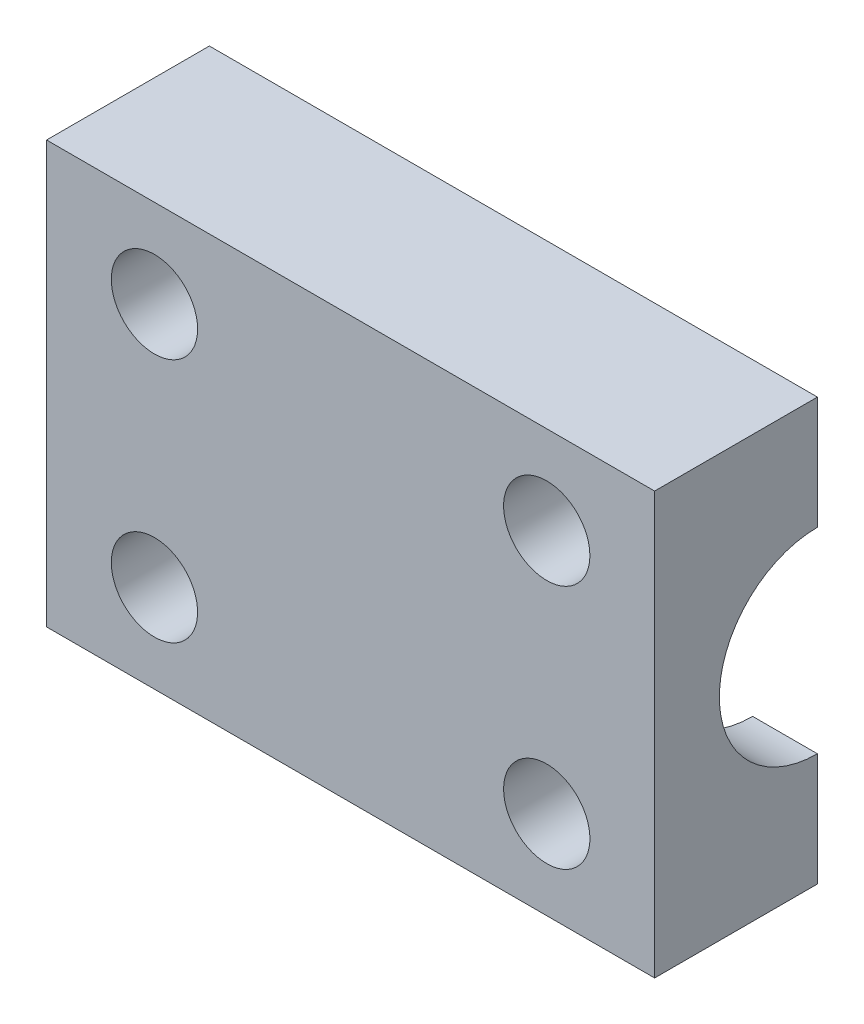
ISO-10303-21;
HEADER;
FILE_DESCRIPTION(('STEP AP214'),'2;1');
FILE_NAME('part.step','',(''),(''),'','','');
FILE_SCHEMA(('AUTOMOTIVE_DESIGN { 1 0 10303 214 1 1 1 1 }'));
ENDSEC;
DATA;
#1=APPLICATION_CONTEXT('core data for automotive mechanical design processes');
#2=APPLICATION_PROTOCOL_DEFINITION('international standard','automotive_design',2000,#1);
#3=PRODUCT_CONTEXT('',#1,'mechanical');
#4=PRODUCT('Part','Part','',(#3));
#5=PRODUCT_RELATED_PRODUCT_CATEGORY('part','',(#4));
#6=PRODUCT_DEFINITION_FORMATION('','',#4);
#7=PRODUCT_DEFINITION_CONTEXT('part definition',#1,'design');
#8=PRODUCT_DEFINITION('design','',#6,#7);
#9=PRODUCT_DEFINITION_SHAPE('','',#8);
#10=(LENGTH_UNIT() NAMED_UNIT(*) SI_UNIT(.MILLI.,.METRE.));
#11=(NAMED_UNIT(*) PLANE_ANGLE_UNIT() SI_UNIT($,.RADIAN.));
#12=(NAMED_UNIT(*) SI_UNIT($,.STERADIAN.) SOLID_ANGLE_UNIT());
#13=UNCERTAINTY_MEASURE_WITH_UNIT(LENGTH_MEASURE(1.E-05),#10,'distance_accuracy_value','');
#14=(GEOMETRIC_REPRESENTATION_CONTEXT(3) GLOBAL_UNCERTAINTY_ASSIGNED_CONTEXT((#13)) GLOBAL_UNIT_ASSIGNED_CONTEXT((#10,
#11,#12)) REPRESENTATION_CONTEXT('',''));
#15=CARTESIAN_POINT('',(0.,0.,0.));
#16=DIRECTION('',(0.,0.,1.));
#17=DIRECTION('',(1.,0.,0.));
#18=AXIS2_PLACEMENT_3D('',#15,#16,#17);
#19=CARTESIAN_POINT('',(18.,10.75,-8.3));
#20=DIRECTION('',(0.,0.,-1.));
#21=DIRECTION('',(-1.,0.,0.));
#22=AXIS2_PLACEMENT_3D('',#19,#20,#21);
#23=PLANE('',#22);
#24=DIRECTION('',(-1.,0.,0.));
#25=VECTOR('',#24,1.);
#26=CARTESIAN_POINT('',(-13.,-5.00000000000001,-8.3));
#27=LINE('',#26,#25);
#28=CARTESIAN_POINT('',(-0.699999999999998,-5.00000000000001,-8.3));
#29=VERTEX_POINT('',#28);
#30=CARTESIAN_POINT('',(-5.3,-5.00000000000001,-8.3));
#31=VERTEX_POINT('',#30);
#32=EDGE_CURVE('E373',#29,#31,#27,.T.);
#33=ORIENTED_EDGE('',*,*,#32,.F.);
#34=DIRECTION('',(0.,1.,0.));
#35=VECTOR('',#34,1.);
#36=CARTESIAN_POINT('',(-0.699999999999998,-7.52320508075776,-8.29999999999999));
#37=LINE('',#36,#35);
#38=CARTESIAN_POINT('',(-0.699999999999998,-7.52320508075776,-8.29999999999999));
#39=VERTEX_POINT('',#38);
#40=EDGE_CURVE('E311',#39,#29,#37,.T.);
#41=ORIENTED_EDGE('',*,*,#40,.F.);
#42=DIRECTION('',(1.,0.,0.));
#43=VECTOR('',#42,1.);
#44=CARTESIAN_POINT('',(-0.699999999999998,-7.52320508075776,-8.29999999999999));
#45=LINE('',#44,#43);
#46=CARTESIAN_POINT('',(5.7,-7.52320508075776,-8.29999999999999));
#47=VERTEX_POINT('',#46);
#48=EDGE_CURVE('E320',#39,#47,#45,.T.);
#49=ORIENTED_EDGE('',*,*,#48,.T.);
#50=DIRECTION('',(0.,1.,0.));
#51=VECTOR('',#50,1.);
#52=CARTESIAN_POINT('',(5.7,-7.52320508075776,-8.29999999999999));
#53=LINE('',#52,#51);
#54=CARTESIAN_POINT('',(5.7,-5.00000000000001,-8.29999999999999));
#55=VERTEX_POINT('',#54);
#56=EDGE_CURVE('E324',#47,#55,#53,.T.);
#57=ORIENTED_EDGE('',*,*,#56,.T.);
#58=DIRECTION('',(-1.,0.,0.));
#59=VECTOR('',#58,1.);
#60=CARTESIAN_POINT('',(5.7,-5.00000000000001,-8.3));
#61=LINE('',#60,#59);
#62=CARTESIAN_POINT('',(10.3,-5.00000000000001,-8.3));
#63=VERTEX_POINT('',#62);
#64=EDGE_CURVE('E440',#63,#55,#61,.T.);
#65=ORIENTED_EDGE('',*,*,#64,.F.);
#66=DIRECTION('',(0.,1.,0.));
#67=VECTOR('',#66,1.);
#68=CARTESIAN_POINT('',(10.3,-6.25,-8.3));
#69=LINE('',#68,#67);
#70=CARTESIAN_POINT('',(10.3,-6.25,-8.3));
#71=VERTEX_POINT('',#70);
#72=EDGE_CURVE('E281',#71,#63,#69,.T.);
#73=ORIENTED_EDGE('',*,*,#72,.F.);
#74=CARTESIAN_POINT('',(12.5,-6.25,-8.3));
#75=DIRECTION('',(0.,0.,-1.));
#76=DIRECTION('',(-1.,0.,0.));
#77=AXIS2_PLACEMENT_3D('',#74,#75,#76);
#78=CIRCLE('',#77,2.2);
#79=CARTESIAN_POINT('',(14.7,-6.25,-8.3));
#80=VERTEX_POINT('',#79);
#81=EDGE_CURVE('E429',#80,#71,#78,.T.);
#82=ORIENTED_EDGE('',*,*,#81,.F.);
#83=DIRECTION('',(0.,-1.,0.));
#84=VECTOR('',#83,1.);
#85=CARTESIAN_POINT('',(14.7,6.25,-8.3));
#86=LINE('',#85,#84);
#87=CARTESIAN_POINT('',(14.7,-5.00000000000001,-8.3));
#88=VERTEX_POINT('',#87);
#89=EDGE_CURVE('E293',#88,#80,#86,.T.);
#90=ORIENTED_EDGE('',*,*,#89,.F.);
#91=CARTESIAN_POINT('',(18.,-5.00000000000001,-8.3));
#92=VERTEX_POINT('',#91);
#93=EDGE_CURVE('E360',#92,#88,#61,.T.);
#94=ORIENTED_EDGE('',*,*,#93,.F.);
#95=DIRECTION('',(0.,-1.,0.));
#96=VECTOR('',#95,1.);
#97=CARTESIAN_POINT('',(18.,10.75,-8.3));
#98=LINE('',#97,#96);
#99=CARTESIAN_POINT('',(18.,-10.75,-8.3));
#100=VERTEX_POINT('',#99);
#101=EDGE_CURVE('E351',#92,#100,#98,.T.);
#102=ORIENTED_EDGE('',*,*,#101,.T.);
#103=DIRECTION('',(-1.,0.,0.));
#104=VECTOR('',#103,1.);
#105=CARTESIAN_POINT('',(18.,-10.75,-8.3));
#106=LINE('',#105,#104);
#107=CARTESIAN_POINT('',(-13.,-10.75,-8.3));
#108=VERTEX_POINT('',#107);
#109=EDGE_CURVE('E243',#100,#108,#106,.T.);
#110=ORIENTED_EDGE('',*,*,#109,.T.);
#111=DIRECTION('',(0.,1.,0.));
#112=VECTOR('',#111,1.);
#113=CARTESIAN_POINT('',(-13.,-10.75,-8.3));
#114=LINE('',#113,#112);
#115=CARTESIAN_POINT('',(-13.,-5.00000000000001,-8.3));
#116=VERTEX_POINT('',#115);
#117=EDGE_CURVE('E242',#108,#116,#114,.T.);
#118=ORIENTED_EDGE('',*,*,#117,.T.);
#119=CARTESIAN_POINT('',(-9.7,-5.00000000000001,-8.3));
#120=VERTEX_POINT('',#119);
#121=EDGE_CURVE('E219',#120,#116,#27,.T.);
#122=ORIENTED_EDGE('',*,*,#121,.F.);
#123=DIRECTION('',(0.,1.,0.));
#124=VECTOR('',#123,1.);
#125=CARTESIAN_POINT('',(-9.7,-6.25,-8.3));
#126=LINE('',#125,#124);
#127=CARTESIAN_POINT('',(-9.7,-6.25,-8.3));
#128=VERTEX_POINT('',#127);
#129=EDGE_CURVE('E372',#128,#120,#126,.T.);
#130=ORIENTED_EDGE('',*,*,#129,.F.);
#131=CARTESIAN_POINT('',(-7.5,-6.25,-8.3));
#132=DIRECTION('',(0.,0.,-1.));
#133=DIRECTION('',(-1.,0.,0.));
#134=AXIS2_PLACEMENT_3D('',#131,#132,#133);
#135=CIRCLE('',#134,2.2);
#136=CARTESIAN_POINT('',(-5.3,-6.25,-8.3));
#137=VERTEX_POINT('',#136);
#138=EDGE_CURVE('E434',#137,#128,#135,.T.);
#139=ORIENTED_EDGE('',*,*,#138,.F.);
#140=DIRECTION('',(0.,-1.,0.));
#141=VECTOR('',#140,1.);
#142=CARTESIAN_POINT('',(-5.3,6.25,-8.3));
#143=LINE('',#142,#141);
#144=EDGE_CURVE('E416',#31,#137,#143,.T.);
#145=ORIENTED_EDGE('',*,*,#144,.F.);
#146=EDGE_LOOP('',(#33,#41,#49,#57,#65,#73,#82,#90,#94,#102,#110,#118,#122,#130,#139,#145));
#147=FACE_BOUND('',#146,.T.);
#148=ADVANCED_FACE('F30',(#147),#23,.T.);
#149=CARTESIAN_POINT('',(-9.7,-6.25,-4.8));
#150=DIRECTION('',(-1.,0.,0.));
#151=DIRECTION('',(0.,-1.,0.));
#152=AXIS2_PLACEMENT_3D('',#149,#150,#151);
#153=PLANE('',#152);
#154=ORIENTED_EDGE('',*,*,#129,.T.);
#155=CARTESIAN_POINT('',(-9.7,0.,-8.3));
#156=DIRECTION('',(-1.,0.,0.));
#157=DIRECTION('',(0.,-1.,0.));
#158=AXIS2_PLACEMENT_3D('',#155,#156,#157);
#159=CIRCLE('',#158,5.00000000000001);
#160=CARTESIAN_POINT('',(-9.70000000000001,-3.57071421427144,-4.8));
#161=VERTEX_POINT('',#160);
#162=EDGE_CURVE('E374',#120,#161,#159,.T.);
#163=ORIENTED_EDGE('',*,*,#162,.T.);
#164=DIRECTION('',(0.,1.,0.));
#165=VECTOR('',#164,1.);
#166=CARTESIAN_POINT('',(-9.7,-6.25,-4.8));
#167=LINE('',#166,#165);
#168=CARTESIAN_POINT('',(-9.7,-6.25,-4.8));
#169=VERTEX_POINT('',#168);
#170=EDGE_CURVE('E400',#169,#161,#167,.T.);
#171=ORIENTED_EDGE('',*,*,#170,.F.);
#172=DIRECTION('',(0.,0.,-1.));
#173=VECTOR('',#172,1.);
#174=CARTESIAN_POINT('',(-9.7,-6.25,-4.8));
#175=LINE('',#174,#173);
#176=EDGE_CURVE('E382',#169,#128,#175,.T.);
#177=ORIENTED_EDGE('',*,*,#176,.T.);
#178=EDGE_LOOP('',(#154,#163,#171,#177));
#179=FACE_BOUND('',#178,.T.);
#180=ADVANCED_FACE('F379',(#179),#153,.F.);
#181=CARTESIAN_POINT('',(-5.3,6.25,-4.8));
#182=DIRECTION('',(1.,0.,0.));
#183=DIRECTION('',(0.,0.,-1.));
#184=AXIS2_PLACEMENT_3D('',#181,#182,#183);
#185=PLANE('',#184);
#186=CARTESIAN_POINT('',(-5.3,6.25000000000002,-8.3));
#187=VERTEX_POINT('',#186);
#188=CARTESIAN_POINT('',(-5.3,5.00000000000001,-8.3));
#189=VERTEX_POINT('',#188);
#190=EDGE_CURVE('E388',#187,#189,#143,.T.);
#191=ORIENTED_EDGE('',*,*,#190,.T.);
#192=CARTESIAN_POINT('',(-5.3,0.,-8.3));
#193=DIRECTION('',(1.,0.,0.));
#194=DIRECTION('',(0.,0.,-1.));
#195=AXIS2_PLACEMENT_3D('',#192,#193,#194);
#196=CIRCLE('',#195,5.00000000000001);
#197=CARTESIAN_POINT('',(-5.3,3.57071421427144,-4.8));
#198=VERTEX_POINT('',#197);
#199=EDGE_CURVE('E451',#189,#198,#196,.T.);
#200=ORIENTED_EDGE('',*,*,#199,.T.);
#201=DIRECTION('',(0.,-1.,0.));
#202=VECTOR('',#201,1.);
#203=CARTESIAN_POINT('',(-5.3,6.25,-4.8));
#204=LINE('',#203,#202);
#205=CARTESIAN_POINT('',(-5.3,6.25,-4.8));
#206=VERTEX_POINT('',#205);
#207=EDGE_CURVE('E411',#206,#198,#204,.T.);
#208=ORIENTED_EDGE('',*,*,#207,.F.);
#209=DIRECTION('',(0.,0.,-1.));
#210=VECTOR('',#209,1.);
#211=CARTESIAN_POINT('',(-5.3,6.25,-4.8));
#212=LINE('',#211,#210);
#213=EDGE_CURVE('E398',#206,#187,#212,.T.);
#214=ORIENTED_EDGE('',*,*,#213,.T.);
#215=EDGE_LOOP('',(#191,#200,#208,#214));
#216=FACE_BOUND('',#215,.T.);
#217=ADVANCED_FACE('F468',(#216),#185,.F.);
#218=CARTESIAN_POINT('',(-7.5,6.25000000000002,-4.8));
#219=DIRECTION('',(0.,0.,1.));
#220=DIRECTION('',(1.,0.,0.));
#221=AXIS2_PLACEMENT_3D('',#218,#219,#220);
#222=PLANE('',#221);
#223=ORIENTED_EDGE('',*,*,#207,.T.);
#224=DIRECTION('',(-1.,0.,0.));
#225=VECTOR('',#224,1.);
#226=CARTESIAN_POINT('',(-13.,3.57071421427144,-4.8));
#227=LINE('',#226,#225);
#228=CARTESIAN_POINT('',(-9.70000000000001,3.57071421427144,-4.8));
#229=VERTEX_POINT('',#228);
#230=EDGE_CURVE('E449',#198,#229,#227,.T.);
#231=ORIENTED_EDGE('',*,*,#230,.T.);
#232=CARTESIAN_POINT('',(-9.7,6.25000000000002,-4.8));
#233=VERTEX_POINT('',#232);
#234=EDGE_CURVE('E405',#229,#233,#167,.T.);
#235=ORIENTED_EDGE('',*,*,#234,.T.);
#236=CARTESIAN_POINT('',(-7.5,6.25000000000002,-4.8));
#237=DIRECTION('',(0.,0.,1.));
#238=DIRECTION('',(1.,0.,0.));
#239=AXIS2_PLACEMENT_3D('',#236,#237,#238);
#240=CIRCLE('',#239,2.2);
#241=EDGE_CURVE('E383',#233,#206,#240,.T.);
#242=ORIENTED_EDGE('',*,*,#241,.T.);
#243=EDGE_LOOP('',(#223,#231,#235,#242));
#244=FACE_BOUND('',#243,.T.);
#245=ADVANCED_FACE('F554',(#244),#222,.F.);
#246=CARTESIAN_POINT('',(5.7,-7.52320508075776,-8.29999999999999));
#247=DIRECTION('',(1.,0.,0.));
#248=DIRECTION('',(0.,0.,-1.));
#249=AXIS2_PLACEMENT_3D('',#246,#247,#248);
#250=PLANE('',#249);
#251=CARTESIAN_POINT('',(5.7,0.,-8.3));
#252=DIRECTION('',(-1.,0.,0.));
#253=DIRECTION('',(0.,0.,1.));
#254=AXIS2_PLACEMENT_3D('',#251,#252,#253);
#255=CIRCLE('',#254,5.00000000000001);
#256=CARTESIAN_POINT('',(5.7,5.00000000000001,-8.3));
#257=VERTEX_POINT('',#256);
#258=EDGE_CURVE('E234',#55,#257,#255,.T.);
#259=ORIENTED_EDGE('',*,*,#258,.F.);
#260=ORIENTED_EDGE('',*,*,#56,.F.);
#261=DIRECTION('',(0.,-0.5,-0.866025403784439));
#262=VECTOR('',#261,1.);
#263=CARTESIAN_POINT('',(5.7,-3.79047005383851,-1.83471328218387));
#264=LINE('',#263,#262);
#265=CARTESIAN_POINT('',(5.7,-3.79047005383851,-1.83471328218387));
#266=VERTEX_POINT('',#265);
#267=EDGE_CURVE('E299',#266,#47,#264,.T.);
#268=ORIENTED_EDGE('',*,*,#267,.F.);
#269=DIRECTION('',(0.,-1.,0.));
#270=VECTOR('',#269,1.);
#271=CARTESIAN_POINT('',(5.7,3.7904700538385,-1.83471328218386));
#272=LINE('',#271,#270);
#273=CARTESIAN_POINT('',(5.7,3.7904700538385,-1.83471328218386));
#274=VERTEX_POINT('',#273);
#275=EDGE_CURVE('E310',#274,#266,#272,.T.);
#276=ORIENTED_EDGE('',*,*,#275,.F.);
#277=DIRECTION('',(0.,-0.5,0.866025403784439));
#278=VECTOR('',#277,1.);
#279=CARTESIAN_POINT('',(5.7,7.52320508075776,-8.3));
#280=LINE('',#279,#278);
#281=CARTESIAN_POINT('',(5.7,7.52320508075776,-8.3));
#282=VERTEX_POINT('',#281);
#283=EDGE_CURVE('E327',#282,#274,#280,.T.);
#284=ORIENTED_EDGE('',*,*,#283,.F.);
#285=EDGE_CURVE('E323',#257,#282,#53,.T.);
#286=ORIENTED_EDGE('',*,*,#285,.F.);
#287=EDGE_LOOP('',(#259,#260,#268,#276,#284,#286));
#288=FACE_BOUND('',#287,.T.);
#289=ADVANCED_FACE('F484',(#288),#250,.F.);
#290=CARTESIAN_POINT('',(10.3,-6.25,-4.8));
#291=DIRECTION('',(-1.,0.,0.));
#292=DIRECTION('',(0.,-1.,0.));
#293=AXIS2_PLACEMENT_3D('',#290,#291,#292);
#294=PLANE('',#293);
#295=ORIENTED_EDGE('',*,*,#72,.T.);
#296=CARTESIAN_POINT('',(10.3,0.,-8.3));
#297=DIRECTION('',(-1.,0.,0.));
#298=DIRECTION('',(0.,-1.,0.));
#299=AXIS2_PLACEMENT_3D('',#296,#297,#298);
#300=CIRCLE('',#299,5.00000000000001);
#301=CARTESIAN_POINT('',(10.3,-3.57071421427144,-4.8));
#302=VERTEX_POINT('',#301);
#303=EDGE_CURVE('E442',#63,#302,#300,.T.);
#304=ORIENTED_EDGE('',*,*,#303,.T.);
#305=DIRECTION('',(0.,1.,0.));
#306=VECTOR('',#305,1.);
#307=CARTESIAN_POINT('',(10.3,-6.25,-4.8));
#308=LINE('',#307,#306);
#309=CARTESIAN_POINT('',(10.3,-6.25,-4.8));
#310=VERTEX_POINT('',#309);
#311=EDGE_CURVE('E267',#310,#302,#308,.T.);
#312=ORIENTED_EDGE('',*,*,#311,.F.);
#313=DIRECTION('',(0.,0.,-1.));
#314=VECTOR('',#313,1.);
#315=CARTESIAN_POINT('',(10.3,-6.25,-4.8));
#316=LINE('',#315,#314);
#317=EDGE_CURVE('E300',#310,#71,#316,.T.);
#318=ORIENTED_EDGE('',*,*,#317,.T.);
#319=EDGE_LOOP('',(#295,#304,#312,#318));
#320=FACE_BOUND('',#319,.T.);
#321=ADVANCED_FACE('F536',(#320),#294,.F.);
#322=CARTESIAN_POINT('',(14.7,6.25,-4.8));
#323=DIRECTION('',(1.,0.,0.));
#324=DIRECTION('',(0.,0.,-1.));
#325=AXIS2_PLACEMENT_3D('',#322,#323,#324);
#326=PLANE('',#325);
#327=CARTESIAN_POINT('',(14.7,6.25000000000002,-8.3));
#328=VERTEX_POINT('',#327);
#329=CARTESIAN_POINT('',(14.7,5.00000000000001,-8.3));
#330=VERTEX_POINT('',#329);
#331=EDGE_CURVE('E289',#328,#330,#86,.T.);
#332=ORIENTED_EDGE('',*,*,#331,.T.);
#333=CARTESIAN_POINT('',(14.7,0.,-8.3));
#334=DIRECTION('',(1.,0.,0.));
#335=DIRECTION('',(0.,0.,-1.));
#336=AXIS2_PLACEMENT_3D('',#333,#334,#335);
#337=CIRCLE('',#336,5.00000000000001);
#338=CARTESIAN_POINT('',(14.7,3.57071421427144,-4.8));
#339=VERTEX_POINT('',#338);
#340=EDGE_CURVE('E446',#330,#339,#337,.T.);
#341=ORIENTED_EDGE('',*,*,#340,.T.);
#342=DIRECTION('',(0.,-1.,0.));
#343=VECTOR('',#342,1.);
#344=CARTESIAN_POINT('',(14.7,6.25,-4.8));
#345=LINE('',#344,#343);
#346=CARTESIAN_POINT('',(14.7,6.25,-4.8));
#347=VERTEX_POINT('',#346);
#348=EDGE_CURVE('E275',#347,#339,#345,.T.);
#349=ORIENTED_EDGE('',*,*,#348,.F.);
#350=DIRECTION('',(0.,0.,-1.));
#351=VECTOR('',#350,1.);
#352=CARTESIAN_POINT('',(14.7,6.25,-4.8));
#353=LINE('',#352,#351);
#354=EDGE_CURVE('E288',#347,#328,#353,.T.);
#355=ORIENTED_EDGE('',*,*,#354,.T.);
#356=EDGE_LOOP('',(#332,#341,#349,#355));
#357=FACE_BOUND('',#356,.T.);
#358=ADVANCED_FACE('F530',(#357),#326,.F.);
#359=CARTESIAN_POINT('',(12.5,6.25,-4.8));
#360=DIRECTION('',(0.,0.,1.));
#361=DIRECTION('',(1.,0.,0.));
#362=AXIS2_PLACEMENT_3D('',#359,#360,#361);
#363=PLANE('',#362);
#364=ORIENTED_EDGE('',*,*,#348,.T.);
#365=DIRECTION('',(-1.,0.,0.));
#366=VECTOR('',#365,1.);
#367=CARTESIAN_POINT('',(5.7,3.57071421427144,-4.8));
#368=LINE('',#367,#366);
#369=CARTESIAN_POINT('',(10.3,3.57071421427144,-4.8));
#370=VERTEX_POINT('',#369);
#371=EDGE_CURVE('E11',#339,#370,#368,.T.);
#372=ORIENTED_EDGE('',*,*,#371,.T.);
#373=CARTESIAN_POINT('',(10.3,6.25,-4.8));
#374=VERTEX_POINT('',#373);
#375=EDGE_CURVE('E286',#370,#374,#308,.T.);
#376=ORIENTED_EDGE('',*,*,#375,.T.);
#377=CARTESIAN_POINT('',(12.5,6.25,-4.8));
#378=DIRECTION('',(0.,0.,1.));
#379=DIRECTION('',(1.,0.,0.));
#380=AXIS2_PLACEMENT_3D('',#377,#378,#379);
#381=CIRCLE('',#380,2.2);
#382=EDGE_CURVE('E276',#374,#347,#381,.T.);
#383=ORIENTED_EDGE('',*,*,#382,.T.);
#384=EDGE_LOOP('',(#364,#372,#376,#383));
#385=FACE_BOUND('',#384,.T.);
#386=ADVANCED_FACE('F525',(#385),#363,.F.);
#387=DIRECTION('',(-1.,0.,0.));
#388=VECTOR('',#387,1.);
#389=CARTESIAN_POINT('',(-13.,5.00000000000001,-8.3));
#390=LINE('',#389,#388);
#391=CARTESIAN_POINT('',(-13.,5.00000000000001,-8.3));
#392=VERTEX_POINT('',#391);
#393=CARTESIAN_POINT('',(-9.70000000000001,5.00000000000001,-8.3));
#394=VERTEX_POINT('',#393);
#395=EDGE_CURVE('E216',#392,#394,#390,.F.);
#396=ORIENTED_EDGE('',*,*,#395,.F.);
#397=CARTESIAN_POINT('',(-13.,10.75,-8.3));
#398=VERTEX_POINT('',#397);
#399=EDGE_CURVE('E230',#392,#398,#114,.T.);
#400=ORIENTED_EDGE('',*,*,#399,.T.);
#401=DIRECTION('',(1.,0.,0.));
#402=VECTOR('',#401,1.);
#403=CARTESIAN_POINT('',(-13.,10.75,-8.3));
#404=LINE('',#403,#402);
#405=CARTESIAN_POINT('',(18.,10.75,-8.3));
#406=VERTEX_POINT('',#405);
#407=EDGE_CURVE('E334',#398,#406,#404,.T.);
#408=ORIENTED_EDGE('',*,*,#407,.T.);
#409=CARTESIAN_POINT('',(18.,5.00000000000001,-8.3));
#410=VERTEX_POINT('',#409);
#411=EDGE_CURVE('E247',#406,#410,#98,.T.);
#412=ORIENTED_EDGE('',*,*,#411,.T.);
#413=DIRECTION('',(-1.,0.,0.));
#414=VECTOR('',#413,1.);
#415=CARTESIAN_POINT('',(5.7,5.00000000000001,-8.3));
#416=LINE('',#415,#414);
#417=EDGE_CURVE('E437',#330,#410,#416,.F.);
#418=ORIENTED_EDGE('',*,*,#417,.F.);
#419=ORIENTED_EDGE('',*,*,#331,.F.);
#420=CARTESIAN_POINT('',(12.5,6.25000000000002,-8.3));
#421=DIRECTION('',(0.,0.,1.));
#422=DIRECTION('',(1.,0.,0.));
#423=AXIS2_PLACEMENT_3D('',#420,#421,#422);
#424=CIRCLE('',#423,2.2);
#425=CARTESIAN_POINT('',(10.3,6.25000000000002,-8.3));
#426=VERTEX_POINT('',#425);
#427=EDGE_CURVE('E420',#328,#426,#424,.T.);
#428=ORIENTED_EDGE('',*,*,#427,.T.);
#429=CARTESIAN_POINT('',(10.3,5.00000000000001,-8.3));
#430=VERTEX_POINT('',#429);
#431=EDGE_CURVE('E292',#430,#426,#69,.T.);
#432=ORIENTED_EDGE('',*,*,#431,.F.);
#433=EDGE_CURVE('E436',#257,#430,#416,.F.);
#434=ORIENTED_EDGE('',*,*,#433,.F.);
#435=ORIENTED_EDGE('',*,*,#285,.T.);
#436=DIRECTION('',(1.,0.,0.));
#437=VECTOR('',#436,1.);
#438=CARTESIAN_POINT('',(-0.699999999999998,7.52320508075776,-8.3));
#439=LINE('',#438,#437);
#440=CARTESIAN_POINT('',(-0.699999999999998,7.52320508075776,-8.3));
#441=VERTEX_POINT('',#440);
#442=EDGE_CURVE('E337',#441,#282,#439,.T.);
#443=ORIENTED_EDGE('',*,*,#442,.F.);
#444=CARTESIAN_POINT('',(-0.699999999999998,5.00000000000001,-8.3));
#445=VERTEX_POINT('',#444);
#446=EDGE_CURVE('E309',#445,#441,#37,.T.);
#447=ORIENTED_EDGE('',*,*,#446,.F.);
#448=EDGE_CURVE('E237',#189,#445,#390,.F.);
#449=ORIENTED_EDGE('',*,*,#448,.F.);
#450=ORIENTED_EDGE('',*,*,#190,.F.);
#451=CARTESIAN_POINT('',(-7.5,6.25000000000002,-8.3));
#452=DIRECTION('',(0.,0.,1.));
#453=DIRECTION('',(1.,0.,0.));
#454=AXIS2_PLACEMENT_3D('',#451,#452,#453);
#455=CIRCLE('',#454,2.2);
#456=CARTESIAN_POINT('',(-9.70000000000001,6.25000000000002,-8.3));
#457=VERTEX_POINT('',#456);
#458=EDGE_CURVE('E414',#187,#457,#455,.T.);
#459=ORIENTED_EDGE('',*,*,#458,.T.);
#460=EDGE_CURVE('E233',#394,#457,#126,.T.);
#461=ORIENTED_EDGE('',*,*,#460,.F.);
#462=EDGE_LOOP('',(#396,#400,#408,#412,#418,#419,#428,#432,#434,#435,#443,#447,#449,#450,#459,#461));
#463=FACE_BOUND('',#462,.T.);
#464=ADVANCED_FACE('F228',(#463),#23,.T.);
#465=CARTESIAN_POINT('',(-13.,10.75,0.));
#466=DIRECTION('',(0.,1.,0.));
#467=DIRECTION('',(0.,0.,1.));
#468=AXIS2_PLACEMENT_3D('',#465,#466,#467);
#469=PLANE('',#468);
#470=ORIENTED_EDGE('',*,*,#407,.F.);
#471=DIRECTION('',(0.,0.,-1.));
#472=VECTOR('',#471,1.);
#473=CARTESIAN_POINT('',(-13.,10.75,0.));
#474=LINE('',#473,#472);
#475=CARTESIAN_POINT('',(-13.,10.75,0.));
#476=VERTEX_POINT('',#475);
#477=EDGE_CURVE('E240',#476,#398,#474,.T.);
#478=ORIENTED_EDGE('',*,*,#477,.F.);
#479=DIRECTION('',(1.,0.,0.));
#480=VECTOR('',#479,1.);
#481=CARTESIAN_POINT('',(-13.,10.75,0.));
#482=LINE('',#481,#480);
#483=CARTESIAN_POINT('',(18.,10.75,0.));
#484=VERTEX_POINT('',#483);
#485=EDGE_CURVE('E245',#476,#484,#482,.T.);
#486=ORIENTED_EDGE('',*,*,#485,.T.);
#487=DIRECTION('',(0.,0.,-1.));
#488=VECTOR('',#487,1.);
#489=CARTESIAN_POINT('',(18.,10.75,0.));
#490=LINE('',#489,#488);
#491=EDGE_CURVE('E257',#484,#406,#490,.T.);
#492=ORIENTED_EDGE('',*,*,#491,.T.);
#493=EDGE_LOOP('',(#470,#478,#486,#492));
#494=FACE_BOUND('',#493,.T.);
#495=ADVANCED_FACE('F32',(#494),#469,.T.);
#496=CARTESIAN_POINT('',(-13.,-10.75,0.));
#497=DIRECTION('',(-1.,0.,0.));
#498=DIRECTION('',(0.,-1.,0.));
#499=AXIS2_PLACEMENT_3D('',#496,#497,#498);
#500=PLANE('',#499);
#501=CARTESIAN_POINT('',(-13.,0.,-8.3));
#502=DIRECTION('',(-1.,0.,0.));
#503=DIRECTION('',(0.,0.,1.));
#504=AXIS2_PLACEMENT_3D('',#501,#502,#503);
#505=CIRCLE('',#504,5.00000000000001);
#506=EDGE_CURVE('E213',#116,#392,#505,.T.);
#507=ORIENTED_EDGE('',*,*,#506,.F.);
#508=ORIENTED_EDGE('',*,*,#117,.F.);
#509=DIRECTION('',(0.,0.,-1.));
#510=VECTOR('',#509,1.);
#511=CARTESIAN_POINT('',(-13.,-10.75,0.));
#512=LINE('',#511,#510);
#513=CARTESIAN_POINT('',(-13.,-10.75,0.));
#514=VERTEX_POINT('',#513);
#515=EDGE_CURVE('E252',#514,#108,#512,.T.);
#516=ORIENTED_EDGE('',*,*,#515,.F.);
#517=DIRECTION('',(0.,1.,0.));
#518=VECTOR('',#517,1.);
#519=CARTESIAN_POINT('',(-13.,-10.75,0.));
#520=LINE('',#519,#518);
#521=EDGE_CURVE('E258',#514,#476,#520,.T.);
#522=ORIENTED_EDGE('',*,*,#521,.T.);
#523=ORIENTED_EDGE('',*,*,#477,.T.);
#524=ORIENTED_EDGE('',*,*,#399,.F.);
#525=EDGE_LOOP('',(#507,#508,#516,#522,#523,#524));
#526=FACE_BOUND('',#525,.T.);
#527=ADVANCED_FACE('F238',(#526),#500,.T.);
#528=CARTESIAN_POINT('',(18.,-10.75,0.));
#529=DIRECTION('',(0.,-1.,0.));
#530=DIRECTION('',(1.,0.,0.));
#531=AXIS2_PLACEMENT_3D('',#528,#529,#530);
#532=PLANE('',#531);
#533=ORIENTED_EDGE('',*,*,#109,.F.);
#534=DIRECTION('',(0.,0.,-1.));
#535=VECTOR('',#534,1.);
#536=CARTESIAN_POINT('',(18.,-10.75,0.));
#537=LINE('',#536,#535);
#538=CARTESIAN_POINT('',(18.,-10.75,0.));
#539=VERTEX_POINT('',#538);
#540=EDGE_CURVE('E254',#539,#100,#537,.T.);
#541=ORIENTED_EDGE('',*,*,#540,.F.);
#542=DIRECTION('',(-1.,0.,0.));
#543=VECTOR('',#542,1.);
#544=CARTESIAN_POINT('',(18.,-10.75,0.));
#545=LINE('',#544,#543);
#546=EDGE_CURVE('E347',#539,#514,#545,.T.);
#547=ORIENTED_EDGE('',*,*,#546,.T.);
#548=ORIENTED_EDGE('',*,*,#515,.T.);
#549=EDGE_LOOP('',(#533,#541,#547,#548));
#550=FACE_BOUND('',#549,.T.);
#551=ADVANCED_FACE('F367',(#550),#532,.T.);
#552=CARTESIAN_POINT('',(18.,10.75,0.));
#553=DIRECTION('',(1.,0.,0.));
#554=DIRECTION('',(0.,0.,-1.));
#555=AXIS2_PLACEMENT_3D('',#552,#553,#554);
#556=PLANE('',#555);
#557=CARTESIAN_POINT('',(18.,0.,-8.3));
#558=DIRECTION('',(-1.,0.,0.));
#559=DIRECTION('',(0.,0.,1.));
#560=AXIS2_PLACEMENT_3D('',#557,#558,#559);
#561=CIRCLE('',#560,5.00000000000001);
#562=EDGE_CURVE('E445',#92,#410,#561,.T.);
#563=ORIENTED_EDGE('',*,*,#562,.T.);
#564=ORIENTED_EDGE('',*,*,#411,.F.);
#565=ORIENTED_EDGE('',*,*,#491,.F.);
#566=DIRECTION('',(0.,-1.,0.));
#567=VECTOR('',#566,1.);
#568=CARTESIAN_POINT('',(18.,10.75,0.));
#569=LINE('',#568,#567);
#570=EDGE_CURVE('E344',#484,#539,#569,.T.);
#571=ORIENTED_EDGE('',*,*,#570,.T.);
#572=ORIENTED_EDGE('',*,*,#540,.T.);
#573=ORIENTED_EDGE('',*,*,#101,.F.);
#574=EDGE_LOOP('',(#563,#564,#565,#571,#572,#573));
#575=FACE_BOUND('',#574,.T.);
#576=ADVANCED_FACE('F363',(#575),#556,.T.);
#577=CARTESIAN_POINT('',(18.,10.75,0.));
#578=DIRECTION('',(0.,0.,-1.));
#579=DIRECTION('',(-1.,0.,0.));
#580=AXIS2_PLACEMENT_3D('',#577,#578,#579);
#581=PLANE('',#580);
#582=CARTESIAN_POINT('',(-7.5,-6.25,0.));
#583=DIRECTION('',(0.,0.,-1.));
#584=DIRECTION('',(-1.,0.,0.));
#585=AXIS2_PLACEMENT_3D('',#582,#583,#584);
#586=CIRCLE('',#585,2.2);
#587=CARTESIAN_POINT('',(-9.7,-6.25,0.));
#588=VERTEX_POINT('',#587);
#589=EDGE_CURVE('E431',#588,#588,#586,.T.);
#590=ORIENTED_EDGE('',*,*,#589,.T.);
#591=EDGE_LOOP('',(#590));
#592=FACE_BOUND('',#591,.T.);
#593=CARTESIAN_POINT('',(12.5,-6.25,0.));
#594=DIRECTION('',(0.,0.,-1.));
#595=DIRECTION('',(-1.,0.,0.));
#596=AXIS2_PLACEMENT_3D('',#593,#594,#595);
#597=CIRCLE('',#596,2.2);
#598=CARTESIAN_POINT('',(10.3,-6.25,0.));
#599=VERTEX_POINT('',#598);
#600=EDGE_CURVE('E426',#599,#599,#597,.T.);
#601=ORIENTED_EDGE('',*,*,#600,.T.);
#602=EDGE_LOOP('',(#601));
#603=FACE_BOUND('',#602,.T.);
#604=CARTESIAN_POINT('',(12.5,6.25000000000002,0.));
#605=DIRECTION('',(0.,0.,1.));
#606=DIRECTION('',(1.,0.,0.));
#607=AXIS2_PLACEMENT_3D('',#604,#605,#606);
#608=CIRCLE('',#607,2.2);
#609=CARTESIAN_POINT('',(14.7,6.25000000000002,0.));
#610=VERTEX_POINT('',#609);
#611=EDGE_CURVE('E423',#610,#610,#608,.T.);
#612=ORIENTED_EDGE('',*,*,#611,.F.);
#613=EDGE_LOOP('',(#612));
#614=FACE_BOUND('',#613,.T.);
#615=CARTESIAN_POINT('',(-7.5,6.25000000000002,0.));
#616=DIRECTION('',(0.,0.,1.));
#617=DIRECTION('',(1.,0.,0.));
#618=AXIS2_PLACEMENT_3D('',#615,#616,#617);
#619=CIRCLE('',#618,2.2);
#620=CARTESIAN_POINT('',(-5.3,6.25000000000002,0.));
#621=VERTEX_POINT('',#620);
#622=EDGE_CURVE('E417',#621,#621,#619,.T.);
#623=ORIENTED_EDGE('',*,*,#622,.F.);
#624=EDGE_LOOP('',(#623));
#625=FACE_BOUND('',#624,.T.);
#626=ORIENTED_EDGE('',*,*,#485,.F.);
#627=ORIENTED_EDGE('',*,*,#521,.F.);
#628=ORIENTED_EDGE('',*,*,#546,.F.);
#629=ORIENTED_EDGE('',*,*,#570,.F.);
#630=EDGE_LOOP('',(#626,#627,#628,#629));
#631=FACE_BOUND('',#630,.T.);
#632=ADVANCED_FACE('F506',(#592,#603,#614,#625,#631),#581,.F.);
#633=CARTESIAN_POINT('',(-0.699999999999998,-3.79047005383851,-1.83471328218387));
#634=DIRECTION('',(0.,-0.866025403784439,0.5));
#635=DIRECTION('',(0.,-0.5,-0.866025403784439));
#636=AXIS2_PLACEMENT_3D('',#633,#634,#635);
#637=PLANE('',#636);
#638=ORIENTED_EDGE('',*,*,#267,.T.);
#639=ORIENTED_EDGE('',*,*,#48,.F.);
#640=DIRECTION('',(0.,-0.5,-0.866025403784439));
#641=VECTOR('',#640,1.);
#642=CARTESIAN_POINT('',(-0.699999999999998,-3.79047005383851,-1.83471328218387));
#643=LINE('',#642,#641);
#644=CARTESIAN_POINT('',(-0.699999999999998,-3.79047005383851,-1.83471328218387));
#645=VERTEX_POINT('',#644);
#646=EDGE_CURVE('E306',#645,#39,#643,.T.);
#647=ORIENTED_EDGE('',*,*,#646,.F.);
#648=DIRECTION('',(1.,0.,0.));
#649=VECTOR('',#648,1.);
#650=CARTESIAN_POINT('',(-0.699999999999998,-3.79047005383851,-1.83471328218387));
#651=LINE('',#650,#649);
#652=EDGE_CURVE('E332',#645,#266,#651,.T.);
#653=ORIENTED_EDGE('',*,*,#652,.T.);
#654=EDGE_LOOP('',(#638,#639,#647,#653));
#655=FACE_BOUND('',#654,.T.);
#656=ADVANCED_FACE('F479',(#655),#637,.F.);
#657=CARTESIAN_POINT('',(-0.699999999999998,3.7904700538385,-1.83471328218386));
#658=DIRECTION('',(0.,0.,1.));
#659=DIRECTION('',(0.,-1.,0.));
#660=AXIS2_PLACEMENT_3D('',#657,#658,#659);
#661=PLANE('',#660);
#662=ORIENTED_EDGE('',*,*,#275,.T.);
#663=ORIENTED_EDGE('',*,*,#652,.F.);
#664=DIRECTION('',(0.,-1.,0.));
#665=VECTOR('',#664,1.);
#666=CARTESIAN_POINT('',(-0.699999999999998,3.7904700538385,-1.83471328218386));
#667=LINE('',#666,#665);
#668=CARTESIAN_POINT('',(-0.699999999999998,3.7904700538385,-1.83471328218386));
#669=VERTEX_POINT('',#668);
#670=EDGE_CURVE('E317',#669,#645,#667,.T.);
#671=ORIENTED_EDGE('',*,*,#670,.F.);
#672=DIRECTION('',(1.,0.,0.));
#673=VECTOR('',#672,1.);
#674=CARTESIAN_POINT('',(-0.699999999999998,3.7904700538385,-1.83471328218386));
#675=LINE('',#674,#673);
#676=EDGE_CURVE('E335',#669,#274,#675,.T.);
#677=ORIENTED_EDGE('',*,*,#676,.T.);
#678=EDGE_LOOP('',(#662,#663,#671,#677));
#679=FACE_BOUND('',#678,.T.);
#680=ADVANCED_FACE('F487',(#679),#661,.F.);
#681=CARTESIAN_POINT('',(-0.699999999999998,7.52320508075776,-8.3));
#682=DIRECTION('',(0.,0.866025403784439,0.5));
#683=DIRECTION('',(0.,-0.5,0.866025403784439));
#684=AXIS2_PLACEMENT_3D('',#681,#682,#683);
#685=PLANE('',#684);
#686=ORIENTED_EDGE('',*,*,#283,.T.);
#687=ORIENTED_EDGE('',*,*,#676,.F.);
#688=DIRECTION('',(0.,-0.5,0.866025403784439));
#689=VECTOR('',#688,1.);
#690=CARTESIAN_POINT('',(-0.699999999999998,7.52320508075776,-8.3));
#691=LINE('',#690,#689);
#692=EDGE_CURVE('E314',#441,#669,#691,.T.);
#693=ORIENTED_EDGE('',*,*,#692,.F.);
#694=ORIENTED_EDGE('',*,*,#442,.T.);
#695=EDGE_LOOP('',(#686,#687,#693,#694));
#696=FACE_BOUND('',#695,.T.);
#697=ADVANCED_FACE('F490',(#696),#685,.F.);
#698=CARTESIAN_POINT('',(-0.699999999999998,-7.52320508075776,-8.29999999999999));
#699=DIRECTION('',(1.,0.,0.));
#700=DIRECTION('',(0.,0.,-1.));
#701=AXIS2_PLACEMENT_3D('',#698,#699,#700);
#702=PLANE('',#701);
#703=CARTESIAN_POINT('',(-0.699999999999998,0.,-8.3));
#704=DIRECTION('',(1.,0.,0.));
#705=DIRECTION('',(0.,0.,-1.));
#706=AXIS2_PLACEMENT_3D('',#703,#704,#705);
#707=CIRCLE('',#706,5.00000000000001);
#708=EDGE_CURVE('E453',#445,#29,#707,.T.);
#709=ORIENTED_EDGE('',*,*,#708,.F.);
#710=ORIENTED_EDGE('',*,*,#446,.T.);
#711=ORIENTED_EDGE('',*,*,#692,.T.);
#712=ORIENTED_EDGE('',*,*,#670,.T.);
#713=ORIENTED_EDGE('',*,*,#646,.T.);
#714=ORIENTED_EDGE('',*,*,#40,.T.);
#715=EDGE_LOOP('',(#709,#710,#711,#712,#713,#714));
#716=FACE_BOUND('',#715,.T.);
#717=ADVANCED_FACE('F474',(#716),#702,.T.);
#718=ORIENTED_EDGE('',*,*,#375,.F.);
#719=EDGE_CURVE('E439',#370,#430,#300,.T.);
#720=ORIENTED_EDGE('',*,*,#719,.T.);
#721=ORIENTED_EDGE('',*,*,#431,.T.);
#722=DIRECTION('',(0.,0.,-1.));
#723=VECTOR('',#722,1.);
#724=CARTESIAN_POINT('',(10.3,6.25,-4.8));
#725=LINE('',#724,#723);
#726=EDGE_CURVE('E296',#374,#426,#725,.T.);
#727=ORIENTED_EDGE('',*,*,#726,.F.);
#728=EDGE_LOOP('',(#718,#720,#721,#727));
#729=FACE_BOUND('',#728,.T.);
#730=ADVANCED_FACE('F498',(#729),#294,.F.);
#731=CARTESIAN_POINT('',(14.7,-3.57071421427144,-4.8));
#732=VERTEX_POINT('',#731);
#733=CARTESIAN_POINT('',(14.7,-6.25,-4.8));
#734=VERTEX_POINT('',#733);
#735=EDGE_CURVE('E264',#732,#734,#345,.T.);
#736=ORIENTED_EDGE('',*,*,#735,.F.);
#737=EDGE_CURVE('E53',#732,#88,#337,.T.);
#738=ORIENTED_EDGE('',*,*,#737,.T.);
#739=ORIENTED_EDGE('',*,*,#89,.T.);
#740=DIRECTION('',(0.,0.,-1.));
#741=VECTOR('',#740,1.);
#742=CARTESIAN_POINT('',(14.7,-6.25,-4.8));
#743=LINE('',#742,#741);
#744=EDGE_CURVE('E274',#734,#80,#743,.T.);
#745=ORIENTED_EDGE('',*,*,#744,.F.);
#746=EDGE_LOOP('',(#736,#738,#739,#745));
#747=FACE_BOUND('',#746,.T.);
#748=ADVANCED_FACE('F271',(#747),#326,.F.);
#749=ORIENTED_EDGE('',*,*,#311,.T.);
#750=DIRECTION('',(-1.,0.,0.));
#751=VECTOR('',#750,1.);
#752=CARTESIAN_POINT('',(5.7,-3.57071421427144,-4.8));
#753=LINE('',#752,#751);
#754=EDGE_CURVE('E38',#302,#732,#753,.F.);
#755=ORIENTED_EDGE('',*,*,#754,.T.);
#756=ORIENTED_EDGE('',*,*,#735,.T.);
#757=CARTESIAN_POINT('',(12.5,-6.25,-4.8));
#758=DIRECTION('',(0.,0.,1.));
#759=DIRECTION('',(1.,0.,0.));
#760=AXIS2_PLACEMENT_3D('',#757,#758,#759);
#761=CIRCLE('',#760,2.2);
#762=EDGE_CURVE('E279',#734,#310,#761,.T.);
#763=ORIENTED_EDGE('',*,*,#762,.T.);
#764=EDGE_LOOP('',(#749,#755,#756,#763));
#765=FACE_BOUND('',#764,.T.);
#766=ADVANCED_FACE('F262',(#765),#363,.F.);
#767=ORIENTED_EDGE('',*,*,#234,.F.);
#768=EDGE_CURVE('E235',#229,#394,#159,.T.);
#769=ORIENTED_EDGE('',*,*,#768,.T.);
#770=ORIENTED_EDGE('',*,*,#460,.T.);
#771=DIRECTION('',(0.,0.,-1.));
#772=VECTOR('',#771,1.);
#773=CARTESIAN_POINT('',(-9.70000000000001,6.25000000000002,-4.8));
#774=LINE('',#773,#772);
#775=EDGE_CURVE('E392',#233,#457,#774,.T.);
#776=ORIENTED_EDGE('',*,*,#775,.F.);
#777=EDGE_LOOP('',(#767,#769,#770,#776));
#778=FACE_BOUND('',#777,.T.);
#779=ADVANCED_FACE('F522',(#778),#153,.F.);
#780=CARTESIAN_POINT('',(-5.3,-3.57071421427144,-4.8));
#781=VERTEX_POINT('',#780);
#782=CARTESIAN_POINT('',(-5.3,-6.25,-4.8));
#783=VERTEX_POINT('',#782);
#784=EDGE_CURVE('E386',#781,#783,#204,.T.);
#785=ORIENTED_EDGE('',*,*,#784,.F.);
#786=EDGE_CURVE('E45',#781,#31,#196,.T.);
#787=ORIENTED_EDGE('',*,*,#786,.T.);
#788=ORIENTED_EDGE('',*,*,#144,.T.);
#789=DIRECTION('',(0.,0.,-1.));
#790=VECTOR('',#789,1.);
#791=CARTESIAN_POINT('',(-5.3,-6.25,-4.8));
#792=LINE('',#791,#790);
#793=EDGE_CURVE('E396',#783,#137,#792,.T.);
#794=ORIENTED_EDGE('',*,*,#793,.F.);
#795=EDGE_LOOP('',(#785,#787,#788,#794));
#796=FACE_BOUND('',#795,.T.);
#797=ADVANCED_FACE('F462',(#796),#185,.F.);
#798=ORIENTED_EDGE('',*,*,#170,.T.);
#799=DIRECTION('',(-1.,0.,0.));
#800=VECTOR('',#799,1.);
#801=CARTESIAN_POINT('',(-13.,-3.57071421427144,-4.8));
#802=LINE('',#801,#800);
#803=EDGE_CURVE('E224',#161,#781,#802,.F.);
#804=ORIENTED_EDGE('',*,*,#803,.T.);
#805=ORIENTED_EDGE('',*,*,#784,.T.);
#806=CARTESIAN_POINT('',(-7.5,-6.25,-4.8));
#807=DIRECTION('',(0.,0.,1.));
#808=DIRECTION('',(1.,0.,0.));
#809=AXIS2_PLACEMENT_3D('',#806,#807,#808);
#810=CIRCLE('',#809,2.2);
#811=EDGE_CURVE('E408',#783,#169,#810,.T.);
#812=ORIENTED_EDGE('',*,*,#811,.T.);
#813=EDGE_LOOP('',(#798,#804,#805,#812));
#814=FACE_BOUND('',#813,.T.);
#815=ADVANCED_FACE('F458',(#814),#222,.F.);
#816=CARTESIAN_POINT('',(-7.5,6.25000000000002,-8.3));
#817=DIRECTION('',(0.,0.,1.));
#818=DIRECTION('',(1.,0.,0.));
#819=AXIS2_PLACEMENT_3D('',#816,#817,#818);
#820=CYLINDRICAL_SURFACE('',#819,2.2);
#821=ORIENTED_EDGE('',*,*,#622,.T.);
#822=EDGE_LOOP('',(#821));
#823=FACE_BOUND('',#822,.T.);
#824=ORIENTED_EDGE('',*,*,#458,.F.);
#825=ORIENTED_EDGE('',*,*,#213,.F.);
#826=ORIENTED_EDGE('',*,*,#241,.F.);
#827=ORIENTED_EDGE('',*,*,#775,.T.);
#828=EDGE_LOOP('',(#824,#825,#826,#827));
#829=FACE_BOUND('',#828,.T.);
#830=ADVANCED_FACE('F717',(#823,#829),#820,.F.);
#831=CARTESIAN_POINT('',(12.5,6.25000000000002,-8.3));
#832=DIRECTION('',(0.,0.,1.));
#833=DIRECTION('',(1.,0.,0.));
#834=AXIS2_PLACEMENT_3D('',#831,#832,#833);
#835=CYLINDRICAL_SURFACE('',#834,2.2);
#836=ORIENTED_EDGE('',*,*,#611,.T.);
#837=EDGE_LOOP('',(#836));
#838=FACE_BOUND('',#837,.T.);
#839=ORIENTED_EDGE('',*,*,#427,.F.);
#840=ORIENTED_EDGE('',*,*,#354,.F.);
#841=ORIENTED_EDGE('',*,*,#382,.F.);
#842=ORIENTED_EDGE('',*,*,#726,.T.);
#843=EDGE_LOOP('',(#839,#840,#841,#842));
#844=FACE_BOUND('',#843,.T.);
#845=ADVANCED_FACE('F712',(#838,#844),#835,.F.);
#846=CARTESIAN_POINT('',(12.5,-6.25,0.));
#847=DIRECTION('',(0.,0.,-1.));
#848=DIRECTION('',(-1.,0.,0.));
#849=AXIS2_PLACEMENT_3D('',#846,#847,#848);
#850=CYLINDRICAL_SURFACE('',#849,2.2);
#851=ORIENTED_EDGE('',*,*,#600,.F.);
#852=EDGE_LOOP('',(#851));
#853=FACE_BOUND('',#852,.T.);
#854=ORIENTED_EDGE('',*,*,#762,.F.);
#855=ORIENTED_EDGE('',*,*,#744,.T.);
#856=ORIENTED_EDGE('',*,*,#81,.T.);
#857=ORIENTED_EDGE('',*,*,#317,.F.);
#858=EDGE_LOOP('',(#854,#855,#856,#857));
#859=FACE_BOUND('',#858,.T.);
#860=ADVANCED_FACE('F674',(#853,#859),#850,.F.);
#861=CARTESIAN_POINT('',(-7.5,-6.25,0.));
#862=DIRECTION('',(0.,0.,-1.));
#863=DIRECTION('',(-1.,0.,0.));
#864=AXIS2_PLACEMENT_3D('',#861,#862,#863);
#865=CYLINDRICAL_SURFACE('',#864,2.2);
#866=ORIENTED_EDGE('',*,*,#589,.F.);
#867=EDGE_LOOP('',(#866));
#868=FACE_BOUND('',#867,.T.);
#869=ORIENTED_EDGE('',*,*,#811,.F.);
#870=ORIENTED_EDGE('',*,*,#793,.T.);
#871=ORIENTED_EDGE('',*,*,#138,.T.);
#872=ORIENTED_EDGE('',*,*,#176,.F.);
#873=EDGE_LOOP('',(#869,#870,#871,#872));
#874=FACE_BOUND('',#873,.T.);
#875=ADVANCED_FACE('F465',(#868,#874),#865,.F.);
#876=CARTESIAN_POINT('',(5.7,0.,-8.3));
#877=DIRECTION('',(-1.,0.,0.));
#878=DIRECTION('',(0.,0.,1.));
#879=AXIS2_PLACEMENT_3D('',#876,#877,#878);
#880=CYLINDRICAL_SURFACE('',#879,5.00000000000001);
#881=ORIENTED_EDGE('',*,*,#433,.T.);
#882=ORIENTED_EDGE('',*,*,#719,.F.);
#883=ORIENTED_EDGE('',*,*,#371,.F.);
#884=ORIENTED_EDGE('',*,*,#340,.F.);
#885=ORIENTED_EDGE('',*,*,#417,.T.);
#886=ORIENTED_EDGE('',*,*,#562,.F.);
#887=ORIENTED_EDGE('',*,*,#93,.T.);
#888=ORIENTED_EDGE('',*,*,#737,.F.);
#889=ORIENTED_EDGE('',*,*,#754,.F.);
#890=ORIENTED_EDGE('',*,*,#303,.F.);
#891=ORIENTED_EDGE('',*,*,#64,.T.);
#892=ORIENTED_EDGE('',*,*,#258,.T.);
#893=EDGE_LOOP('',(#881,#882,#883,#884,#885,#886,#887,#888,#889,#890,#891,#892));
#894=FACE_BOUND('',#893,.T.);
#895=ADVANCED_FACE('F495',(#894),#880,.F.);
#896=CARTESIAN_POINT('',(-13.,0.,-8.3));
#897=DIRECTION('',(-1.,0.,0.));
#898=DIRECTION('',(0.,0.,1.));
#899=AXIS2_PLACEMENT_3D('',#896,#897,#898);
#900=CYLINDRICAL_SURFACE('',#899,5.00000000000001);
#901=ORIENTED_EDGE('',*,*,#395,.T.);
#902=ORIENTED_EDGE('',*,*,#768,.F.);
#903=ORIENTED_EDGE('',*,*,#230,.F.);
#904=ORIENTED_EDGE('',*,*,#199,.F.);
#905=ORIENTED_EDGE('',*,*,#448,.T.);
#906=ORIENTED_EDGE('',*,*,#708,.T.);
#907=ORIENTED_EDGE('',*,*,#32,.T.);
#908=ORIENTED_EDGE('',*,*,#786,.F.);
#909=ORIENTED_EDGE('',*,*,#803,.F.);
#910=ORIENTED_EDGE('',*,*,#162,.F.);
#911=ORIENTED_EDGE('',*,*,#121,.T.);
#912=ORIENTED_EDGE('',*,*,#506,.T.);
#913=EDGE_LOOP('',(#901,#902,#903,#904,#905,#906,#907,#908,#909,#910,#911,#912));
#914=FACE_BOUND('',#913,.T.);
#915=ADVANCED_FACE('F215',(#914),#900,.F.);
#916=CLOSED_SHELL('',(#148,#180,#217,#245,#289,#321,#358,#386,#464,#495,#527,#551,#576,#632,
#656,#680,#697,#717,#730,#748,#766,#779,#797,#815,#830,#845,#860,#875,#895,#915));
#917=MANIFOLD_SOLID_BREP('B2',#916);
#918=ADVANCED_BREP_SHAPE_REPRESENTATION('',(#18,#917),#14);
#919=SHAPE_DEFINITION_REPRESENTATION(#9,#918);
ENDSEC;
END-ISO-10303-21;
